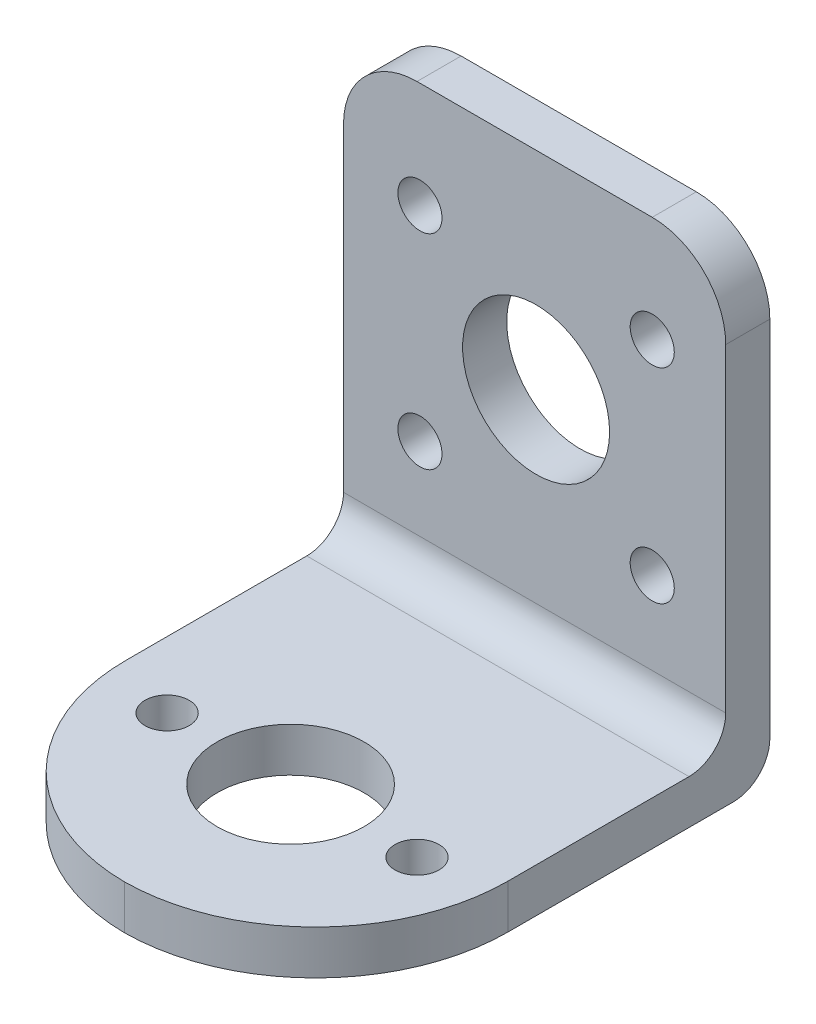
ISO-10303-21;
HEADER;
FILE_DESCRIPTION(('STEP AP214'),'2;1');
FILE_NAME('part.step','',(''),(''),'','','');
FILE_SCHEMA(('AUTOMOTIVE_DESIGN { 1 0 10303 214 1 1 1 1 }'));
ENDSEC;
DATA;
#1=APPLICATION_CONTEXT('core data for automotive mechanical design processes');
#2=APPLICATION_PROTOCOL_DEFINITION('international standard','automotive_design',2000,#1);
#3=PRODUCT_CONTEXT('',#1,'mechanical');
#4=PRODUCT('Part','Part','',(#3));
#5=PRODUCT_RELATED_PRODUCT_CATEGORY('part','',(#4));
#6=PRODUCT_DEFINITION_FORMATION('','',#4);
#7=PRODUCT_DEFINITION_CONTEXT('part definition',#1,'design');
#8=PRODUCT_DEFINITION('design','',#6,#7);
#9=PRODUCT_DEFINITION_SHAPE('','',#8);
#10=(LENGTH_UNIT() NAMED_UNIT(*) SI_UNIT(.MILLI.,.METRE.));
#11=(NAMED_UNIT(*) PLANE_ANGLE_UNIT() SI_UNIT($,.RADIAN.));
#12=(NAMED_UNIT(*) SI_UNIT($,.STERADIAN.) SOLID_ANGLE_UNIT());
#13=UNCERTAINTY_MEASURE_WITH_UNIT(LENGTH_MEASURE(1.E-05),#10,'distance_accuracy_value','');
#14=(GEOMETRIC_REPRESENTATION_CONTEXT(3) GLOBAL_UNCERTAINTY_ASSIGNED_CONTEXT((#13)) GLOBAL_UNIT_ASSIGNED_CONTEXT((#10,
#11,#12)) REPRESENTATION_CONTEXT('',''));
#15=CARTESIAN_POINT('',(0.,0.,0.));
#16=DIRECTION('',(0.,0.,1.));
#17=DIRECTION('',(1.,0.,0.));
#18=AXIS2_PLACEMENT_3D('',#15,#16,#17);
#19=CARTESIAN_POINT('',(-0.0999997773975889,-16.75,17.8));
#20=DIRECTION('',(0.,1.,0.));
#21=DIRECTION('',(0.,0.,1.));
#22=AXIS2_PLACEMENT_3D('',#19,#20,#21);
#23=CYLINDRICAL_SURFACE('',#22,13.1);
#24=CARTESIAN_POINT('',(-0.0999997773975889,-13.75,17.8));
#25=DIRECTION('',(0.,1.,0.));
#26=DIRECTION('',(0.,0.,1.));
#27=AXIS2_PLACEMENT_3D('',#24,#25,#26);
#28=CIRCLE('',#27,13.1);
#29=CARTESIAN_POINT('',(1.11301268792803E-07,-13.75,30.8996183158999));
#30=VERTEX_POINT('',#29);
#31=CARTESIAN_POINT('',(13.0000002226024,-13.75,17.8));
#32=VERTEX_POINT('',#31);
#33=EDGE_CURVE('E167',#30,#32,#28,.T.);
#34=ORIENTED_EDGE('',*,*,#33,.F.);
#35=DIRECTION('',(0.,1.,0.));
#36=VECTOR('',#35,1.);
#37=CARTESIAN_POINT('',(1.11301268792803E-07,-16.75,30.8996183158999));
#38=LINE('',#37,#36);
#39=CARTESIAN_POINT('',(1.11301268792803E-07,-16.75,30.8996183158999));
#40=VERTEX_POINT('',#39);
#41=EDGE_CURVE('E151',#40,#30,#38,.T.);
#42=ORIENTED_EDGE('',*,*,#41,.F.);
#43=CARTESIAN_POINT('',(-0.0999997773975889,-16.75,17.8));
#44=DIRECTION('',(0.,1.,0.));
#45=DIRECTION('',(0.,0.,1.));
#46=AXIS2_PLACEMENT_3D('',#43,#44,#45);
#47=CIRCLE('',#46,13.1);
#48=CARTESIAN_POINT('',(13.0000002226024,-16.75,17.8));
#49=VERTEX_POINT('',#48);
#50=EDGE_CURVE('E144',#40,#49,#47,.T.);
#51=ORIENTED_EDGE('',*,*,#50,.T.);
#52=DIRECTION('',(0.,1.,0.));
#53=VECTOR('',#52,1.);
#54=CARTESIAN_POINT('',(13.0000002226024,-16.75,17.8));
#55=LINE('',#54,#53);
#56=EDGE_CURVE('E124',#49,#32,#55,.T.);
#57=ORIENTED_EDGE('',*,*,#56,.T.);
#58=EDGE_LOOP('',(#34,#42,#51,#57));
#59=FACE_BOUND('',#58,.T.);
#60=ADVANCED_FACE('F41',(#59),#23,.T.);
#61=CARTESIAN_POINT('',(0.1,-16.75,17.8));
#62=DIRECTION('',(0.,1.,0.));
#63=DIRECTION('',(0.,0.,1.));
#64=AXIS2_PLACEMENT_3D('',#61,#62,#63);
#65=CYLINDRICAL_SURFACE('',#64,13.1);
#66=CARTESIAN_POINT('',(0.1,-13.75,17.8));
#67=DIRECTION('',(0.,1.,0.));
#68=DIRECTION('',(0.,0.,1.));
#69=AXIS2_PLACEMENT_3D('',#66,#67,#68);
#70=CIRCLE('',#69,13.1);
#71=CARTESIAN_POINT('',(-13.,-13.75,17.8));
#72=VERTEX_POINT('',#71);
#73=EDGE_CURVE('E153',#72,#30,#70,.T.);
#74=ORIENTED_EDGE('',*,*,#73,.F.);
#75=DIRECTION('',(0.,1.,0.));
#76=VECTOR('',#75,1.);
#77=CARTESIAN_POINT('',(-13.,-16.75,17.8));
#78=LINE('',#77,#76);
#79=CARTESIAN_POINT('',(-13.,-16.75,17.8));
#80=VERTEX_POINT('',#79);
#81=EDGE_CURVE('E177',#80,#72,#78,.T.);
#82=ORIENTED_EDGE('',*,*,#81,.F.);
#83=CARTESIAN_POINT('',(0.1,-16.75,17.8));
#84=DIRECTION('',(0.,1.,0.));
#85=DIRECTION('',(0.,0.,1.));
#86=AXIS2_PLACEMENT_3D('',#83,#84,#85);
#87=CIRCLE('',#86,13.1);
#88=EDGE_CURVE('E137',#80,#40,#87,.T.);
#89=ORIENTED_EDGE('',*,*,#88,.T.);
#90=ORIENTED_EDGE('',*,*,#41,.T.);
#91=EDGE_LOOP('',(#74,#82,#89,#90));
#92=FACE_BOUND('',#91,.T.);
#93=ADVANCED_FACE('F280',(#92),#65,.T.);
#94=CARTESIAN_POINT('',(-13.,-16.75,0.));
#95=DIRECTION('',(-1.,0.,0.));
#96=DIRECTION('',(0.,0.,1.));
#97=AXIS2_PLACEMENT_3D('',#94,#95,#96);
#98=PLANE('',#97);
#99=DIRECTION('',(0.,-1.,0.));
#100=VECTOR('',#99,1.);
#101=CARTESIAN_POINT('',(-13.,15.45,3.));
#102=LINE('',#101,#100);
#103=CARTESIAN_POINT('',(-13.,10.45,3.));
#104=VERTEX_POINT('',#103);
#105=CARTESIAN_POINT('',(-13.,-11.25,3.));
#106=VERTEX_POINT('',#105);
#107=EDGE_CURVE('E160',#104,#106,#102,.T.);
#108=ORIENTED_EDGE('',*,*,#107,.F.);
#109=DIRECTION('',(0.,0.,1.));
#110=VECTOR('',#109,1.);
#111=CARTESIAN_POINT('',(-13.,10.45,0.));
#112=LINE('',#111,#110);
#113=CARTESIAN_POINT('',(-13.,10.45,0.));
#114=VERTEX_POINT('',#113);
#115=EDGE_CURVE('E11',#104,#114,#112,.F.);
#116=ORIENTED_EDGE('',*,*,#115,.T.);
#117=DIRECTION('',(0.,1.,0.));
#118=VECTOR('',#117,1.);
#119=CARTESIAN_POINT('',(-13.,-16.75,0.));
#120=LINE('',#119,#118);
#121=CARTESIAN_POINT('',(-13.,-14.25,0.));
#122=VERTEX_POINT('',#121);
#123=EDGE_CURVE('E181',#122,#114,#120,.T.);
#124=ORIENTED_EDGE('',*,*,#123,.F.);
#125=CARTESIAN_POINT('',(-13.,-14.25,2.5));
#126=DIRECTION('',(-1.,0.,0.));
#127=DIRECTION('',(0.,0.,1.));
#128=AXIS2_PLACEMENT_3D('',#125,#126,#127);
#129=CIRCLE('',#128,2.5);
#130=CARTESIAN_POINT('',(-13.,-16.75,2.5));
#131=VERTEX_POINT('',#130);
#132=EDGE_CURVE('E190',#122,#131,#129,.T.);
#133=ORIENTED_EDGE('',*,*,#132,.T.);
#134=DIRECTION('',(0.,0.,1.));
#135=VECTOR('',#134,1.);
#136=CARTESIAN_POINT('',(-13.,-16.75,0.));
#137=LINE('',#136,#135);
#138=EDGE_CURVE('E149',#131,#80,#137,.T.);
#139=ORIENTED_EDGE('',*,*,#138,.T.);
#140=ORIENTED_EDGE('',*,*,#81,.T.);
#141=DIRECTION('',(0.,0.,1.));
#142=VECTOR('',#141,1.);
#143=CARTESIAN_POINT('',(-13.,-13.75,0.));
#144=LINE('',#143,#142);
#145=CARTESIAN_POINT('',(-13.,-13.75,5.5));
#146=VERTEX_POINT('',#145);
#147=EDGE_CURVE('E157',#146,#72,#144,.T.);
#148=ORIENTED_EDGE('',*,*,#147,.F.);
#149=CARTESIAN_POINT('',(-13.,-11.25,5.5));
#150=DIRECTION('',(-1.,0.,0.));
#151=DIRECTION('',(0.,0.,1.));
#152=AXIS2_PLACEMENT_3D('',#149,#150,#151);
#153=CIRCLE('',#152,2.5);
#154=EDGE_CURVE('E208',#146,#106,#153,.F.);
#155=ORIENTED_EDGE('',*,*,#154,.T.);
#156=EDGE_LOOP('',(#108,#116,#124,#133,#139,#140,#148,#155));
#157=FACE_BOUND('',#156,.T.);
#158=ADVANCED_FACE('F255',(#157),#98,.T.);
#159=CARTESIAN_POINT('',(13.0000002226024,-16.75,0.));
#160=DIRECTION('',(0.,0.,-1.));
#161=DIRECTION('',(-1.,0.,0.));
#162=AXIS2_PLACEMENT_3D('',#159,#160,#161);
#163=PLANE('',#162);
#164=CARTESIAN_POINT('',(-7.8,8.25,0.));
#165=DIRECTION('',(0.,0.,1.));
#166=DIRECTION('',(1.,0.,0.));
#167=AXIS2_PLACEMENT_3D('',#164,#165,#166);
#168=CIRCLE('',#167,1.5);
#169=CARTESIAN_POINT('',(-6.3,8.25,0.));
#170=VERTEX_POINT('',#169);
#171=EDGE_CURVE('E573',#170,#170,#168,.T.);
#172=ORIENTED_EDGE('',*,*,#171,.T.);
#173=EDGE_LOOP('',(#172));
#174=FACE_BOUND('',#173,.T.);
#175=CARTESIAN_POINT('',(8.,-5.65,0.));
#176=DIRECTION('',(0.,0.,1.));
#177=DIRECTION('',(1.,0.,0.));
#178=AXIS2_PLACEMENT_3D('',#175,#176,#177);
#179=CIRCLE('',#178,1.5);
#180=CARTESIAN_POINT('',(9.5,-5.65,0.));
#181=VERTEX_POINT('',#180);
#182=EDGE_CURVE('E565',#181,#181,#179,.T.);
#183=ORIENTED_EDGE('',*,*,#182,.T.);
#184=EDGE_LOOP('',(#183));
#185=FACE_BOUND('',#184,.T.);
#186=CARTESIAN_POINT('',(-7.8,-5.65,0.));
#187=DIRECTION('',(0.,0.,1.));
#188=DIRECTION('',(1.,0.,0.));
#189=AXIS2_PLACEMENT_3D('',#186,#187,#188);
#190=CIRCLE('',#189,1.5);
#191=CARTESIAN_POINT('',(-6.3,-5.65,0.));
#192=VERTEX_POINT('',#191);
#193=EDGE_CURVE('E557',#192,#192,#190,.T.);
#194=ORIENTED_EDGE('',*,*,#193,.T.);
#195=EDGE_LOOP('',(#194));
#196=FACE_BOUND('',#195,.T.);
#197=CARTESIAN_POINT('',(8.,8.25,0.));
#198=DIRECTION('',(0.,0.,1.));
#199=DIRECTION('',(1.,0.,0.));
#200=AXIS2_PLACEMENT_3D('',#197,#198,#199);
#201=CIRCLE('',#200,1.5);
#202=CARTESIAN_POINT('',(9.5,8.25,0.));
#203=VERTEX_POINT('',#202);
#204=EDGE_CURVE('E549',#203,#203,#201,.T.);
#205=ORIENTED_EDGE('',*,*,#204,.T.);
#206=EDGE_LOOP('',(#205));
#207=FACE_BOUND('',#206,.T.);
#208=CARTESIAN_POINT('',(0.1,1.35,0.));
#209=DIRECTION('',(0.,0.,1.));
#210=DIRECTION('',(1.,0.,0.));
#211=AXIS2_PLACEMENT_3D('',#208,#209,#210);
#212=CIRCLE('',#211,5.);
#213=CARTESIAN_POINT('',(5.1,1.35,0.));
#214=VERTEX_POINT('',#213);
#215=EDGE_CURVE('E541',#214,#214,#212,.T.);
#216=ORIENTED_EDGE('',*,*,#215,.T.);
#217=EDGE_LOOP('',(#216));
#218=FACE_BOUND('',#217,.T.);
#219=DIRECTION('',(-1.,0.,0.));
#220=VECTOR('',#219,1.);
#221=CARTESIAN_POINT('',(-13.,15.45,0.));
#222=LINE('',#221,#220);
#223=CARTESIAN_POINT('',(8.0000002226024,15.45,0.));
#224=VERTEX_POINT('',#223);
#225=CARTESIAN_POINT('',(-8.,15.45,0.));
#226=VERTEX_POINT('',#225);
#227=EDGE_CURVE('E243',#224,#226,#222,.T.);
#228=ORIENTED_EDGE('',*,*,#227,.F.);
#229=CARTESIAN_POINT('',(8.00000022260241,10.45,0.));
#230=DIRECTION('',(0.,0.,-1.));
#231=DIRECTION('',(-1.,0.,0.));
#232=AXIS2_PLACEMENT_3D('',#229,#230,#231);
#233=CIRCLE('',#232,5.);
#234=CARTESIAN_POINT('',(13.0000002226024,10.45,0.));
#235=VERTEX_POINT('',#234);
#236=EDGE_CURVE('E223',#224,#235,#233,.T.);
#237=ORIENTED_EDGE('',*,*,#236,.T.);
#238=DIRECTION('',(0.,1.,0.));
#239=VECTOR('',#238,1.);
#240=CARTESIAN_POINT('',(13.0000002226024,-16.75,0.));
#241=LINE('',#240,#239);
#242=CARTESIAN_POINT('',(13.0000002226024,-14.25,0.));
#243=VERTEX_POINT('',#242);
#244=EDGE_CURVE('E136',#243,#235,#241,.T.);
#245=ORIENTED_EDGE('',*,*,#244,.F.);
#246=DIRECTION('',(-1.,0.,0.));
#247=VECTOR('',#246,1.);
#248=CARTESIAN_POINT('',(-13.,-14.25,0.));
#249=LINE('',#248,#247);
#250=EDGE_CURVE('E176',#243,#122,#249,.T.);
#251=ORIENTED_EDGE('',*,*,#250,.T.);
#252=ORIENTED_EDGE('',*,*,#123,.T.);
#253=CARTESIAN_POINT('',(-8.,10.45,0.));
#254=DIRECTION('',(0.,0.,-1.));
#255=DIRECTION('',(-1.,0.,0.));
#256=AXIS2_PLACEMENT_3D('',#253,#254,#255);
#257=CIRCLE('',#256,5.);
#258=EDGE_CURVE('E220',#114,#226,#257,.T.);
#259=ORIENTED_EDGE('',*,*,#258,.T.);
#260=EDGE_LOOP('',(#228,#237,#245,#251,#252,#259));
#261=FACE_BOUND('',#260,.T.);
#262=ADVANCED_FACE('F248',(#174,#185,#196,#207,#218,#261),#163,.T.);
#263=CARTESIAN_POINT('',(13.0000002226024,-16.75,17.8));
#264=DIRECTION('',(1.,0.,0.));
#265=DIRECTION('',(0.,0.,-1.));
#266=AXIS2_PLACEMENT_3D('',#263,#264,#265);
#267=PLANE('',#266);
#268=ORIENTED_EDGE('',*,*,#244,.T.);
#269=DIRECTION('',(0.,0.,-1.));
#270=VECTOR('',#269,1.);
#271=CARTESIAN_POINT('',(13.0000002226024,10.45,3.));
#272=LINE('',#271,#270);
#273=CARTESIAN_POINT('',(13.,10.45,3.));
#274=VERTEX_POINT('',#273);
#275=EDGE_CURVE('E65',#235,#274,#272,.F.);
#276=ORIENTED_EDGE('',*,*,#275,.T.);
#277=DIRECTION('',(0.,-1.,0.));
#278=VECTOR('',#277,1.);
#279=CARTESIAN_POINT('',(13.,15.45,3.));
#280=LINE('',#279,#278);
#281=CARTESIAN_POINT('',(13.,-11.25,3.));
#282=VERTEX_POINT('',#281);
#283=EDGE_CURVE('E234',#274,#282,#280,.T.);
#284=ORIENTED_EDGE('',*,*,#283,.T.);
#285=CARTESIAN_POINT('',(13.0000002226024,-11.25,5.5));
#286=DIRECTION('',(1.,0.,0.));
#287=DIRECTION('',(0.,0.,-1.));
#288=AXIS2_PLACEMENT_3D('',#285,#286,#287);
#289=CIRCLE('',#288,2.5);
#290=CARTESIAN_POINT('',(13.0000002226024,-13.75,5.5));
#291=VERTEX_POINT('',#290);
#292=EDGE_CURVE('E205',#282,#291,#289,.F.);
#293=ORIENTED_EDGE('',*,*,#292,.T.);
#294=DIRECTION('',(0.,0.,-1.));
#295=VECTOR('',#294,1.);
#296=CARTESIAN_POINT('',(13.0000002226024,-13.75,17.8));
#297=LINE('',#296,#295);
#298=EDGE_CURVE('E130',#32,#291,#297,.T.);
#299=ORIENTED_EDGE('',*,*,#298,.F.);
#300=ORIENTED_EDGE('',*,*,#56,.F.);
#301=DIRECTION('',(0.,0.,-1.));
#302=VECTOR('',#301,1.);
#303=CARTESIAN_POINT('',(13.0000002226024,-16.75,17.8));
#304=LINE('',#303,#302);
#305=CARTESIAN_POINT('',(13.0000002226024,-16.75,2.5));
#306=VERTEX_POINT('',#305);
#307=EDGE_CURVE('E127',#49,#306,#304,.T.);
#308=ORIENTED_EDGE('',*,*,#307,.T.);
#309=CARTESIAN_POINT('',(13.0000002226024,-14.25,2.5));
#310=DIRECTION('',(1.,0.,0.));
#311=DIRECTION('',(0.,0.,-1.));
#312=AXIS2_PLACEMENT_3D('',#309,#310,#311);
#313=CIRCLE('',#312,2.5);
#314=EDGE_CURVE('E195',#306,#243,#313,.T.);
#315=ORIENTED_EDGE('',*,*,#314,.T.);
#316=EDGE_LOOP('',(#268,#276,#284,#293,#299,#300,#308,#315));
#317=FACE_BOUND('',#316,.T.);
#318=ADVANCED_FACE('F126',(#317),#267,.T.);
#319=CARTESIAN_POINT('',(-0.0999997773975889,-16.75,17.8));
#320=DIRECTION('',(0.,1.,0.));
#321=DIRECTION('',(0.,0.,1.));
#322=AXIS2_PLACEMENT_3D('',#319,#320,#321);
#323=PLANE('',#322);
#324=CARTESIAN_POINT('',(8.5,-16.75,19.5));
#325=DIRECTION('',(0.,1.,0.));
#326=DIRECTION('',(0.,0.,1.));
#327=AXIS2_PLACEMENT_3D('',#324,#325,#326);
#328=CIRCLE('',#327,1.5);
#329=CARTESIAN_POINT('',(8.5,-16.75,21.));
#330=VERTEX_POINT('',#329);
#331=EDGE_CURVE('E533',#330,#330,#328,.T.);
#332=ORIENTED_EDGE('',*,*,#331,.T.);
#333=EDGE_LOOP('',(#332));
#334=FACE_BOUND('',#333,.T.);
#335=CARTESIAN_POINT('',(-8.5,-16.75,19.5));
#336=DIRECTION('',(0.,1.,0.));
#337=DIRECTION('',(0.,0.,1.));
#338=AXIS2_PLACEMENT_3D('',#335,#336,#337);
#339=CIRCLE('',#338,1.5);
#340=CARTESIAN_POINT('',(-8.5,-16.75,21.));
#341=VERTEX_POINT('',#340);
#342=EDGE_CURVE('E524',#341,#341,#339,.T.);
#343=ORIENTED_EDGE('',*,*,#342,.T.);
#344=EDGE_LOOP('',(#343));
#345=FACE_BOUND('',#344,.T.);
#346=CARTESIAN_POINT('',(-0.0999998062849059,-16.75,19.5));
#347=DIRECTION('',(0.,1.,0.));
#348=DIRECTION('',(0.,0.,1.));
#349=AXIS2_PLACEMENT_3D('',#346,#347,#348);
#350=CIRCLE('',#349,5.);
#351=CARTESIAN_POINT('',(-0.0999998062849059,-16.75,24.5));
#352=VERTEX_POINT('',#351);
#353=EDGE_CURVE('E259',#352,#352,#350,.T.);
#354=ORIENTED_EDGE('',*,*,#353,.T.);
#355=EDGE_LOOP('',(#354));
#356=FACE_BOUND('',#355,.T.);
#357=ORIENTED_EDGE('',*,*,#138,.F.);
#358=DIRECTION('',(-1.,0.,0.));
#359=VECTOR('',#358,1.);
#360=CARTESIAN_POINT('',(13.0000002226024,-16.75,2.5));
#361=LINE('',#360,#359);
#362=EDGE_CURVE('E147',#131,#306,#361,.F.);
#363=ORIENTED_EDGE('',*,*,#362,.T.);
#364=ORIENTED_EDGE('',*,*,#307,.F.);
#365=ORIENTED_EDGE('',*,*,#50,.F.);
#366=ORIENTED_EDGE('',*,*,#88,.F.);
#367=EDGE_LOOP('',(#357,#363,#364,#365,#366));
#368=FACE_BOUND('',#367,.T.);
#369=ADVANCED_FACE('F142',(#334,#345,#356,#368),#323,.F.);
#370=CARTESIAN_POINT('',(-0.0999997773975889,-13.75,17.8));
#371=DIRECTION('',(0.,1.,0.));
#372=DIRECTION('',(0.,0.,1.));
#373=AXIS2_PLACEMENT_3D('',#370,#371,#372);
#374=PLANE('',#373);
#375=CARTESIAN_POINT('',(8.5,-13.75,19.5));
#376=DIRECTION('',(0.,1.,0.));
#377=DIRECTION('',(0.,0.,1.));
#378=AXIS2_PLACEMENT_3D('',#375,#376,#377);
#379=CIRCLE('',#378,1.49999999999999);
#380=CARTESIAN_POINT('',(8.5,-13.75,21.));
#381=VERTEX_POINT('',#380);
#382=EDGE_CURVE('E537',#381,#381,#379,.T.);
#383=ORIENTED_EDGE('',*,*,#382,.F.);
#384=EDGE_LOOP('',(#383));
#385=FACE_BOUND('',#384,.T.);
#386=CARTESIAN_POINT('',(-8.5,-13.75,19.5));
#387=DIRECTION('',(0.,1.,0.));
#388=DIRECTION('',(0.,0.,1.));
#389=AXIS2_PLACEMENT_3D('',#386,#387,#388);
#390=CIRCLE('',#389,1.49999999999999);
#391=CARTESIAN_POINT('',(-8.5,-13.75,21.));
#392=VERTEX_POINT('',#391);
#393=EDGE_CURVE('E527',#392,#392,#390,.T.);
#394=ORIENTED_EDGE('',*,*,#393,.F.);
#395=EDGE_LOOP('',(#394));
#396=FACE_BOUND('',#395,.T.);
#397=CARTESIAN_POINT('',(-0.0999998062849059,-13.75,19.5));
#398=DIRECTION('',(0.,1.,0.));
#399=DIRECTION('',(0.,0.,1.));
#400=AXIS2_PLACEMENT_3D('',#397,#398,#399);
#401=CIRCLE('',#400,4.99999999999999);
#402=CARTESIAN_POINT('',(-0.0999998062849059,-13.75,24.5));
#403=VERTEX_POINT('',#402);
#404=EDGE_CURVE('E263',#403,#403,#401,.T.);
#405=ORIENTED_EDGE('',*,*,#404,.F.);
#406=EDGE_LOOP('',(#405));
#407=FACE_BOUND('',#406,.T.);
#408=ORIENTED_EDGE('',*,*,#298,.T.);
#409=DIRECTION('',(1.,0.,0.));
#410=VECTOR('',#409,1.);
#411=CARTESIAN_POINT('',(-0.0999997773975889,-13.75,5.5));
#412=LINE('',#411,#410);
#413=EDGE_CURVE('E202',#291,#146,#412,.F.);
#414=ORIENTED_EDGE('',*,*,#413,.T.);
#415=ORIENTED_EDGE('',*,*,#147,.T.);
#416=ORIENTED_EDGE('',*,*,#73,.T.);
#417=ORIENTED_EDGE('',*,*,#33,.T.);
#418=EDGE_LOOP('',(#408,#414,#415,#416,#417));
#419=FACE_BOUND('',#418,.T.);
#420=ADVANCED_FACE('F276',(#385,#396,#407,#419),#374,.T.);
#421=CARTESIAN_POINT('',(13.,15.45,3.));
#422=DIRECTION('',(0.,0.,-1.));
#423=DIRECTION('',(-1.,0.,0.));
#424=AXIS2_PLACEMENT_3D('',#421,#422,#423);
#425=PLANE('',#424);
#426=CARTESIAN_POINT('',(-7.8,8.25,3.));
#427=DIRECTION('',(0.,0.,1.));
#428=DIRECTION('',(1.,0.,0.));
#429=AXIS2_PLACEMENT_3D('',#426,#427,#428);
#430=CIRCLE('',#429,1.49999999999999);
#431=CARTESIAN_POINT('',(-6.30000000000001,8.25,3.));
#432=VERTEX_POINT('',#431);
#433=EDGE_CURVE('E577',#432,#432,#430,.T.);
#434=ORIENTED_EDGE('',*,*,#433,.F.);
#435=EDGE_LOOP('',(#434));
#436=FACE_BOUND('',#435,.T.);
#437=CARTESIAN_POINT('',(8.,-5.65,3.));
#438=DIRECTION('',(0.,0.,1.));
#439=DIRECTION('',(1.,0.,0.));
#440=AXIS2_PLACEMENT_3D('',#437,#438,#439);
#441=CIRCLE('',#440,1.49999999999999);
#442=CARTESIAN_POINT('',(9.49999999999999,-5.65,3.));
#443=VERTEX_POINT('',#442);
#444=EDGE_CURVE('E569',#443,#443,#441,.T.);
#445=ORIENTED_EDGE('',*,*,#444,.F.);
#446=EDGE_LOOP('',(#445));
#447=FACE_BOUND('',#446,.T.);
#448=CARTESIAN_POINT('',(-7.8,-5.65,3.));
#449=DIRECTION('',(0.,0.,1.));
#450=DIRECTION('',(1.,0.,0.));
#451=AXIS2_PLACEMENT_3D('',#448,#449,#450);
#452=CIRCLE('',#451,1.49999999999999);
#453=CARTESIAN_POINT('',(-6.30000000000001,-5.65,3.));
#454=VERTEX_POINT('',#453);
#455=EDGE_CURVE('E561',#454,#454,#452,.T.);
#456=ORIENTED_EDGE('',*,*,#455,.F.);
#457=EDGE_LOOP('',(#456));
#458=FACE_BOUND('',#457,.T.);
#459=CARTESIAN_POINT('',(8.,8.25,3.));
#460=DIRECTION('',(0.,0.,1.));
#461=DIRECTION('',(1.,0.,0.));
#462=AXIS2_PLACEMENT_3D('',#459,#460,#461);
#463=CIRCLE('',#462,1.49999999999999);
#464=CARTESIAN_POINT('',(9.49999999999999,8.25,3.));
#465=VERTEX_POINT('',#464);
#466=EDGE_CURVE('E553',#465,#465,#463,.T.);
#467=ORIENTED_EDGE('',*,*,#466,.F.);
#468=EDGE_LOOP('',(#467));
#469=FACE_BOUND('',#468,.T.);
#470=CARTESIAN_POINT('',(0.1,1.35,3.));
#471=DIRECTION('',(0.,0.,1.));
#472=DIRECTION('',(1.,0.,0.));
#473=AXIS2_PLACEMENT_3D('',#470,#471,#472);
#474=CIRCLE('',#473,4.99999999999999);
#475=CARTESIAN_POINT('',(5.09999999999999,1.35,3.));
#476=VERTEX_POINT('',#475);
#477=EDGE_CURVE('E545',#476,#476,#474,.T.);
#478=ORIENTED_EDGE('',*,*,#477,.F.);
#479=EDGE_LOOP('',(#478));
#480=FACE_BOUND('',#479,.T.);
#481=ORIENTED_EDGE('',*,*,#283,.F.);
#482=CARTESIAN_POINT('',(8.00000022260241,10.45,3.));
#483=DIRECTION('',(0.,0.,-1.));
#484=DIRECTION('',(-1.,0.,0.));
#485=AXIS2_PLACEMENT_3D('',#482,#483,#484);
#486=CIRCLE('',#485,5.);
#487=CARTESIAN_POINT('',(8.00000022260241,15.45,3.));
#488=VERTEX_POINT('',#487);
#489=EDGE_CURVE('E50',#274,#488,#486,.F.);
#490=ORIENTED_EDGE('',*,*,#489,.T.);
#491=DIRECTION('',(1.,0.,0.));
#492=VECTOR('',#491,1.);
#493=CARTESIAN_POINT('',(13.,15.45,3.));
#494=LINE('',#493,#492);
#495=CARTESIAN_POINT('',(-7.99999999999999,15.45,3.));
#496=VERTEX_POINT('',#495);
#497=EDGE_CURVE('E233',#496,#488,#494,.T.);
#498=ORIENTED_EDGE('',*,*,#497,.F.);
#499=CARTESIAN_POINT('',(-8.,10.45,3.));
#500=DIRECTION('',(0.,0.,-1.));
#501=DIRECTION('',(-1.,0.,0.));
#502=AXIS2_PLACEMENT_3D('',#499,#500,#501);
#503=CIRCLE('',#502,5.);
#504=EDGE_CURVE('E57',#496,#104,#503,.F.);
#505=ORIENTED_EDGE('',*,*,#504,.T.);
#506=ORIENTED_EDGE('',*,*,#107,.T.);
#507=DIRECTION('',(1.,0.,0.));
#508=VECTOR('',#507,1.);
#509=CARTESIAN_POINT('',(13.,-11.25,3.));
#510=LINE('',#509,#508);
#511=EDGE_CURVE('E198',#106,#282,#510,.T.);
#512=ORIENTED_EDGE('',*,*,#511,.T.);
#513=EDGE_LOOP('',(#481,#490,#498,#505,#506,#512));
#514=FACE_BOUND('',#513,.T.);
#515=ADVANCED_FACE('F232',(#436,#447,#458,#469,#480,#514),#425,.F.);
#516=CARTESIAN_POINT('',(0.,15.45,0.));
#517=DIRECTION('',(0.,-1.,0.));
#518=DIRECTION('',(0.,0.,-1.));
#519=AXIS2_PLACEMENT_3D('',#516,#517,#518);
#520=PLANE('',#519);
#521=ORIENTED_EDGE('',*,*,#497,.T.);
#522=DIRECTION('',(0.,0.,-1.));
#523=VECTOR('',#522,1.);
#524=CARTESIAN_POINT('',(8.00000022260241,15.45,0.));
#525=LINE('',#524,#523);
#526=EDGE_CURVE('E216',#488,#224,#525,.T.);
#527=ORIENTED_EDGE('',*,*,#526,.T.);
#528=ORIENTED_EDGE('',*,*,#227,.T.);
#529=DIRECTION('',(0.,0.,1.));
#530=VECTOR('',#529,1.);
#531=CARTESIAN_POINT('',(-8.,15.45,3.));
#532=LINE('',#531,#530);
#533=EDGE_CURVE('E212',#226,#496,#532,.T.);
#534=ORIENTED_EDGE('',*,*,#533,.T.);
#535=EDGE_LOOP('',(#521,#527,#528,#534));
#536=FACE_BOUND('',#535,.T.);
#537=ADVANCED_FACE('F238',(#536),#520,.F.);
#538=CARTESIAN_POINT('',(-0.0999998062849059,-13.75,19.5));
#539=DIRECTION('',(0.,1.,0.));
#540=DIRECTION('',(0.,0.,1.));
#541=AXIS2_PLACEMENT_3D('',#538,#539,#540);
#542=CYLINDRICAL_SURFACE('',#541,4.99999999999999);
#543=ORIENTED_EDGE('',*,*,#353,.F.);
#544=EDGE_LOOP('',(#543));
#545=FACE_BOUND('',#544,.T.);
#546=ORIENTED_EDGE('',*,*,#404,.T.);
#547=EDGE_LOOP('',(#546));
#548=FACE_BOUND('',#547,.T.);
#549=ADVANCED_FACE('F323',(#545,#548),#542,.F.);
#550=CARTESIAN_POINT('',(-8.5,-13.75,19.5));
#551=DIRECTION('',(0.,1.,0.));
#552=DIRECTION('',(0.,0.,1.));
#553=AXIS2_PLACEMENT_3D('',#550,#551,#552);
#554=CYLINDRICAL_SURFACE('',#553,1.49999999999999);
#555=ORIENTED_EDGE('',*,*,#342,.F.);
#556=EDGE_LOOP('',(#555));
#557=FACE_BOUND('',#556,.T.);
#558=ORIENTED_EDGE('',*,*,#393,.T.);
#559=EDGE_LOOP('',(#558));
#560=FACE_BOUND('',#559,.T.);
#561=ADVANCED_FACE('F452',(#557,#560),#554,.F.);
#562=CARTESIAN_POINT('',(8.5,-13.75,19.5));
#563=DIRECTION('',(0.,1.,0.));
#564=DIRECTION('',(0.,0.,1.));
#565=AXIS2_PLACEMENT_3D('',#562,#563,#564);
#566=CYLINDRICAL_SURFACE('',#565,1.49999999999999);
#567=ORIENTED_EDGE('',*,*,#331,.F.);
#568=EDGE_LOOP('',(#567));
#569=FACE_BOUND('',#568,.T.);
#570=ORIENTED_EDGE('',*,*,#382,.T.);
#571=EDGE_LOOP('',(#570));
#572=FACE_BOUND('',#571,.T.);
#573=ADVANCED_FACE('F441',(#569,#572),#566,.F.);
#574=CARTESIAN_POINT('',(0.1,1.35,3.));
#575=DIRECTION('',(0.,0.,1.));
#576=DIRECTION('',(1.,0.,0.));
#577=AXIS2_PLACEMENT_3D('',#574,#575,#576);
#578=CYLINDRICAL_SURFACE('',#577,4.99999999999999);
#579=ORIENTED_EDGE('',*,*,#215,.F.);
#580=EDGE_LOOP('',(#579));
#581=FACE_BOUND('',#580,.T.);
#582=ORIENTED_EDGE('',*,*,#477,.T.);
#583=EDGE_LOOP('',(#582));
#584=FACE_BOUND('',#583,.T.);
#585=ADVANCED_FACE('F430',(#581,#584),#578,.F.);
#586=CARTESIAN_POINT('',(8.,8.25,3.));
#587=DIRECTION('',(0.,0.,1.));
#588=DIRECTION('',(1.,0.,0.));
#589=AXIS2_PLACEMENT_3D('',#586,#587,#588);
#590=CYLINDRICAL_SURFACE('',#589,1.49999999999999);
#591=ORIENTED_EDGE('',*,*,#204,.F.);
#592=EDGE_LOOP('',(#591));
#593=FACE_BOUND('',#592,.T.);
#594=ORIENTED_EDGE('',*,*,#466,.T.);
#595=EDGE_LOOP('',(#594));
#596=FACE_BOUND('',#595,.T.);
#597=ADVANCED_FACE('F419',(#593,#596),#590,.F.);
#598=CARTESIAN_POINT('',(-7.8,-5.65,3.));
#599=DIRECTION('',(0.,0.,1.));
#600=DIRECTION('',(1.,0.,0.));
#601=AXIS2_PLACEMENT_3D('',#598,#599,#600);
#602=CYLINDRICAL_SURFACE('',#601,1.49999999999999);
#603=ORIENTED_EDGE('',*,*,#193,.F.);
#604=EDGE_LOOP('',(#603));
#605=FACE_BOUND('',#604,.T.);
#606=ORIENTED_EDGE('',*,*,#455,.T.);
#607=EDGE_LOOP('',(#606));
#608=FACE_BOUND('',#607,.T.);
#609=ADVANCED_FACE('F408',(#605,#608),#602,.F.);
#610=CARTESIAN_POINT('',(8.,-5.65,3.));
#611=DIRECTION('',(0.,0.,1.));
#612=DIRECTION('',(1.,0.,0.));
#613=AXIS2_PLACEMENT_3D('',#610,#611,#612);
#614=CYLINDRICAL_SURFACE('',#613,1.49999999999999);
#615=ORIENTED_EDGE('',*,*,#182,.F.);
#616=EDGE_LOOP('',(#615));
#617=FACE_BOUND('',#616,.T.);
#618=ORIENTED_EDGE('',*,*,#444,.T.);
#619=EDGE_LOOP('',(#618));
#620=FACE_BOUND('',#619,.T.);
#621=ADVANCED_FACE('F397',(#617,#620),#614,.F.);
#622=CARTESIAN_POINT('',(-7.8,8.25,3.));
#623=DIRECTION('',(0.,0.,1.));
#624=DIRECTION('',(1.,0.,0.));
#625=AXIS2_PLACEMENT_3D('',#622,#623,#624);
#626=CYLINDRICAL_SURFACE('',#625,1.49999999999999);
#627=ORIENTED_EDGE('',*,*,#171,.F.);
#628=EDGE_LOOP('',(#627));
#629=FACE_BOUND('',#628,.T.);
#630=ORIENTED_EDGE('',*,*,#433,.T.);
#631=EDGE_LOOP('',(#630));
#632=FACE_BOUND('',#631,.T.);
#633=ADVANCED_FACE('F299',(#629,#632),#626,.F.);
#634=CARTESIAN_POINT('',(13.0000002226024,-14.25,2.5));
#635=DIRECTION('',(1.,0.,0.));
#636=DIRECTION('',(0.,0.,-1.));
#637=AXIS2_PLACEMENT_3D('',#634,#635,#636);
#638=CYLINDRICAL_SURFACE('',#637,2.5);
#639=ORIENTED_EDGE('',*,*,#314,.F.);
#640=ORIENTED_EDGE('',*,*,#362,.F.);
#641=ORIENTED_EDGE('',*,*,#132,.F.);
#642=ORIENTED_EDGE('',*,*,#250,.F.);
#643=EDGE_LOOP('',(#639,#640,#641,#642));
#644=FACE_BOUND('',#643,.T.);
#645=ADVANCED_FACE('F251',(#644),#638,.T.);
#646=CARTESIAN_POINT('',(13.,-11.25,5.5));
#647=DIRECTION('',(1.,0.,0.));
#648=DIRECTION('',(0.,0.,-1.));
#649=AXIS2_PLACEMENT_3D('',#646,#647,#648);
#650=CYLINDRICAL_SURFACE('',#649,2.5);
#651=ORIENTED_EDGE('',*,*,#154,.F.);
#652=ORIENTED_EDGE('',*,*,#413,.F.);
#653=ORIENTED_EDGE('',*,*,#292,.F.);
#654=ORIENTED_EDGE('',*,*,#511,.F.);
#655=EDGE_LOOP('',(#651,#652,#653,#654));
#656=FACE_BOUND('',#655,.T.);
#657=ADVANCED_FACE('F274',(#656),#650,.F.);
#658=CARTESIAN_POINT('',(8.00000022260241,10.45,0.));
#659=DIRECTION('',(0.,0.,1.));
#660=DIRECTION('',(1.,0.,0.));
#661=AXIS2_PLACEMENT_3D('',#658,#659,#660);
#662=CYLINDRICAL_SURFACE('',#661,5.);
#663=ORIENTED_EDGE('',*,*,#489,.F.);
#664=ORIENTED_EDGE('',*,*,#275,.F.);
#665=ORIENTED_EDGE('',*,*,#236,.F.);
#666=ORIENTED_EDGE('',*,*,#526,.F.);
#667=EDGE_LOOP('',(#663,#664,#665,#666));
#668=FACE_BOUND('',#667,.T.);
#669=ADVANCED_FACE('F245',(#668),#662,.T.);
#670=CARTESIAN_POINT('',(-8.,10.45,0.));
#671=DIRECTION('',(0.,0.,-1.));
#672=DIRECTION('',(-1.,0.,0.));
#673=AXIS2_PLACEMENT_3D('',#670,#671,#672);
#674=CYLINDRICAL_SURFACE('',#673,5.);
#675=ORIENTED_EDGE('',*,*,#258,.F.);
#676=ORIENTED_EDGE('',*,*,#115,.F.);
#677=ORIENTED_EDGE('',*,*,#504,.F.);
#678=ORIENTED_EDGE('',*,*,#533,.F.);
#679=EDGE_LOOP('',(#675,#676,#677,#678));
#680=FACE_BOUND('',#679,.T.);
#681=ADVANCED_FACE('F43',(#680),#674,.T.);
#682=CLOSED_SHELL('',(#60,#93,#158,#262,#318,#369,#420,#515,#537,#549,#561,#573,#585,#597,#609,
#621,#633,#645,#657,#669,#681));
#683=MANIFOLD_SOLID_BREP('B2',#682);
#684=ADVANCED_BREP_SHAPE_REPRESENTATION('',(#18,#683),#14);
#685=SHAPE_DEFINITION_REPRESENTATION(#9,#684);
ENDSEC;
END-ISO-10303-21;
